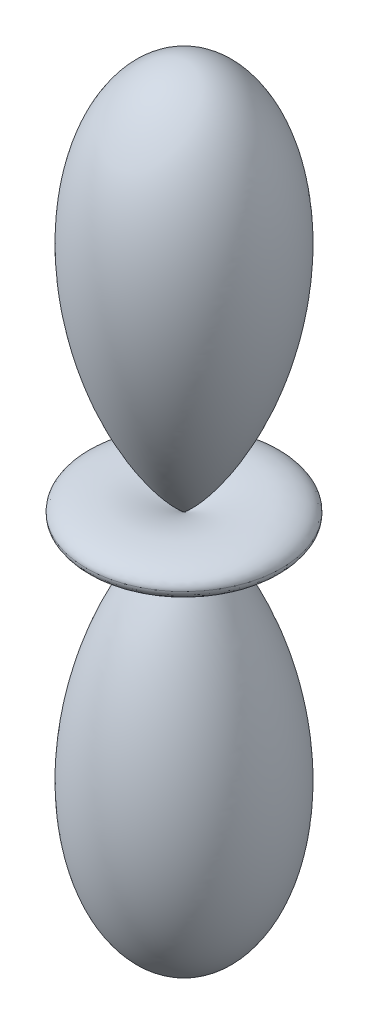
ISO-10303-21;
HEADER;
FILE_DESCRIPTION(('STEP AP214'),'2;1');
FILE_NAME('part.step','',(''),(''),'','','');
FILE_SCHEMA(('AUTOMOTIVE_DESIGN { 1 0 10303 214 1 1 1 1 }'));
ENDSEC;
DATA;
#1=APPLICATION_CONTEXT('core data for automotive mechanical design processes');
#2=APPLICATION_PROTOCOL_DEFINITION('international standard','automotive_design',2000,#1);
#3=PRODUCT_CONTEXT('',#1,'mechanical');
#4=PRODUCT('Part','Part','',(#3));
#5=PRODUCT_RELATED_PRODUCT_CATEGORY('part','',(#4));
#6=PRODUCT_DEFINITION_FORMATION('','',#4);
#7=PRODUCT_DEFINITION_CONTEXT('part definition',#1,'design');
#8=PRODUCT_DEFINITION('design','',#6,#7);
#9=PRODUCT_DEFINITION_SHAPE('','',#8);
#10=(LENGTH_UNIT() NAMED_UNIT(*) SI_UNIT(.MILLI.,.METRE.));
#11=(NAMED_UNIT(*) PLANE_ANGLE_UNIT() SI_UNIT($,.RADIAN.));
#12=(NAMED_UNIT(*) SI_UNIT($,.STERADIAN.) SOLID_ANGLE_UNIT());
#13=UNCERTAINTY_MEASURE_WITH_UNIT(LENGTH_MEASURE(1.E-05),#10,'distance_accuracy_value','');
#14=(GEOMETRIC_REPRESENTATION_CONTEXT(3) GLOBAL_UNCERTAINTY_ASSIGNED_CONTEXT((#13)) GLOBAL_UNIT_ASSIGNED_CONTEXT((#10,
#11,#12)) REPRESENTATION_CONTEXT('',''));
#15=CARTESIAN_POINT('',(0.,0.,0.));
#16=DIRECTION('',(0.,0.,1.));
#17=DIRECTION('',(1.,0.,0.));
#18=AXIS2_PLACEMENT_3D('',#15,#16,#17);
#19=CARTESIAN_POINT('',(-3.18160596551925E-10,-397.887357729739,0.));
#20=CARTESIAN_POINT('',(0.0876504563904565,-397.887357729739,0.));
#21=CARTESIAN_POINT('',(0.455246439323767,-397.886468376197,0.));
#22=CARTESIAN_POINT('',(1.23162692503277,-397.878338216358,0.));
#23=CARTESIAN_POINT('',(2.17816795492282,-397.85014010203,0.));
#24=CARTESIAN_POINT('',(3.42580082338765,-397.790228454526,0.));
#25=CARTESIAN_POINT('',(4.61694574441913,-397.704522118945,0.));
#26=CARTESIAN_POINT('',(5.8372099096875,-397.593127933542,0.));
#27=CARTESIAN_POINT('',(7.03680046975008,-397.456186465257,0.));
#28=CARTESIAN_POINT('',(8.24326881354219,-397.293864905155,0.));
#29=CARTESIAN_POINT('',(9.74070403642557,-397.059490697206,0.));
#30=CARTESIAN_POINT('',(11.5323435921975,-396.728331741206,0.));
#31=CARTESIAN_POINT('',(14.1993788228932,-396.139454654907,0.));
#32=CARTESIAN_POINT('',(17.1251078448229,-395.325351156734,0.));
#33=CARTESIAN_POINT('',(20.00306167225,-394.358372910581,0.));
#34=CARTESIAN_POINT('',(22.8275552870454,-393.246661374221,0.));
#35=CARTESIAN_POINT('',(25.0522772715719,-392.273842316122,0.));
#36=CARTESIAN_POINT('',(27.2404080284615,-391.221084751251,0.));
#37=CARTESIAN_POINT('',(29.3900091673878,-390.091943787361,0.));
#38=CARTESIAN_POINT('',(31.4997849788266,-388.889992927602,0.));
#39=CARTESIAN_POINT('',(33.5685065388073,-387.618775275836,0.));
#40=CARTESIAN_POINT('',(35.806800371351,-386.14228218634,0.));
#41=CARTESIAN_POINT('',(38.1979295205893,-384.440415498137,0.));
#42=CARTESIAN_POINT('',(41.4045621989811,-381.968292232635,0.));
#43=CARTESIAN_POINT('',(45.3949781887864,-378.533936735467,0.));
#44=CARTESIAN_POINT('',(49.8451997328688,-374.177288751914,0.));
#45=CARTESIAN_POINT('',(54.6128617558829,-368.797656252933,0.));
#46=CARTESIAN_POINT('',(59.0791765708193,-363.039031310991,0.));
#47=CARTESIAN_POINT('',(63.2465695725189,-356.94800101845,0.));
#48=CARTESIAN_POINT('',(67.1177629586468,-350.555675947556,0.));
#49=CARTESIAN_POINT('',(70.6527151593706,-343.971914028209,0.));
#50=CARTESIAN_POINT('',(73.8696440192901,-337.227704026216,0.));
#51=CARTESIAN_POINT('',(76.7536827100675,-330.436353023047,0.));
#52=CARTESIAN_POINT('',(79.3312978323709,-323.622876862487,0.));
#53=CARTESIAN_POINT('',(81.6520570285523,-316.717900074025,0.));
#54=CARTESIAN_POINT('',(83.7279596472421,-309.735584110901,0.));
#55=CARTESIAN_POINT('',(85.5699578131044,-302.68808515525,0.));
#56=CARTESIAN_POINT('',(87.1880795300196,-295.585972247842,0.));
#57=CARTESIAN_POINT('',(88.942263810361,-286.65152246637,0.));
#58=CARTESIAN_POINT('',(90.634475607638,-275.855522596578,0.));
#59=CARTESIAN_POINT('',(92.0398463543524,-263.182278757286,0.));
#60=CARTESIAN_POINT('',(92.916574192383,-248.637066331278,0.));
#61=CARTESIAN_POINT('',(93.1535113171598,-230.424773429299,0.));
#62=CARTESIAN_POINT('',(92.1347610441264,-208.583371905416,0.));
#63=CARTESIAN_POINT('',(89.1749268947525,-183.237650127363,0.));
#64=CARTESIAN_POINT('',(83.5256085425216,-154.629371503166,0.));
#65=CARTESIAN_POINT('',(75.7142629698706,-126.535499634635,0.));
#66=CARTESIAN_POINT('',(65.7943584916801,-99.1143486196402,0.));
#67=CARTESIAN_POINT('',(55.2691219539122,-75.8686972192706,0.));
#68=CARTESIAN_POINT('',(44.8868051032124,-56.6252039829437,0.));
#69=CARTESIAN_POINT('',(36.2317154672219,-42.7031826375667,0.));
#70=CARTESIAN_POINT('',(30.0759734769353,-33.6745616475581,0.));
#71=CARTESIAN_POINT('',(24.6703567724537,-26.3478237188819,0.));
#72=CARTESIAN_POINT('',(20.7321581462809,-21.336474857701,0.));
#73=CARTESIAN_POINT('',(17.237624132657,-17.1374379781833,0.));
#74=CARTESIAN_POINT('',(14.2224594020669,-13.6930057563079,0.));
#75=CARTESIAN_POINT('',(11.7336664479238,-10.9647244342948,0.));
#76=CARTESIAN_POINT('',(9.48856143117925,-8.6140836467625,0.));
#77=CARTESIAN_POINT('',(7.50503651166222,-6.6264277595999,0.));
#78=CARTESIAN_POINT('',(5.81919546230837,-5.00368188602272,0.));
#79=CARTESIAN_POINT('',(4.44884280338863,-3.72835762372999,0.));
#80=CARTESIAN_POINT('',(3.12338180727249,-2.54192336814065,0.));
#81=CARTESIAN_POINT('',(1.98538799992224,-1.56719715100692,0.));
#82=CARTESIAN_POINT('',(1.11538786524937,-0.855424104387772,0.));
#83=CARTESIAN_POINT('',(0.525671322615955,-0.392426362562673,0.));
#84=CARTESIAN_POINT('',(0.226996678456167,-0.165878191205637,0.));
#85=CARTESIAN_POINT('',(0.0759431183166673,-0.0549189067636391,0.));
#86=CARTESIAN_POINT('',(0.,0.,0.));
#87=B_SPLINE_CURVE_WITH_KNOTS('',4,(#19,#20,#21,#22,#23,#24,#25,#26,#27,#28,#29,#30,#31,#32,#33,
#34,#35,#36,#37,#38,#39,#40,#41,#42,#43,#44,#45,#46,#47,#48,#49,#50,#51,#52,#53,#54,#55,#56,#57,
#58,#59,#60,#61,#62,#63,#64,#65,#66,#67,#68,#69,#70,#71,#72,#73,#74,#75,#76,#77,#78,#79,#80,#81,
#82,#83,#84,#85,#86),.UNSPECIFIED.,.F.,.F.,(5,1,1,1,1,1,1,1,1,1,1,1,1,1,1,1,1,1,1,1,1,1,1,1,1,1,
1,1,1,1,1,1,1,1,1,1,1,1,1,1,1,1,1,1,1,1,1,1,1,1,1,1,1,1,1,1,1,1,1,1,1,1,1,1,5),(0.,
0.000754004804656705,0.00315938997927523,0.00556477515389364,0.00797016032851217,
0.0103755455031307,0.0127809306777492,0.0151863158523677,0.0175917010269863,0.0199970862016048,
0.0248078501139453,0.0296186140262856,0.0392401418509665,0.0440509213389743,0.048861700826982,
0.0536724803149898,0.0584832598029976,0.0632940770893701,0.0681048943757425,0.0729157116621151,
0.0777265289484875,0.0845451585888202,0.0913637882291529,0.105001047509818,0.119433355983627,
0.133865664457436,0.148297964287333,0.16273026411723,0.177902333107707,0.193074402098184,
0.207506746820802,0.22193909154342,0.236371436266038,0.250803780988657,0.265236179496005,
0.279668578003354,0.294100976510703,0.308533375018051,0.337398102681039,0.366262830344026,
0.395127612891473,0.423992395438919,0.481721926972363,0.539451476743425,0.597181026294302,
0.654910573922178,0.712640073793555,0.77036960007663,0.799234329837761,0.828099059598893,
0.842531441759112,0.856963823919332,0.871396206079551,0.878612397159661,0.885828588239771,
0.893247469982135,0.900666351724498,0.904375792595681,0.908085233466863,0.911794674338045,
0.915504115209226,0.9184754871816,0.919961173167786,0.92070401616088,0.921446859153973),.UNSPECIFIED.);
#88=CARTESIAN_POINT('',(0.,0.,0.));
#89=DIRECTION('',(0.,1.,0.));
#90=AXIS1_PLACEMENT('',#88,#89);
#91=SURFACE_OF_REVOLUTION('',#87,#90);
#92=CARTESIAN_POINT('',(0.,0.,0.));
#93=VERTEX_POINT('',#92);
#94=VERTEX_LOOP('',#93);
#95=FACE_BOUND('',#94,.T.);
#96=CARTESIAN_POINT('',(0.,-397.887357729739,0.));
#97=VERTEX_POINT('',#96);
#98=VERTEX_LOOP('',#97);
#99=FACE_BOUND('',#98,.T.);
#100=ADVANCED_FACE('P0_F16',(#95,#99),#91,.T.);
#101=CLOSED_SHELL('',(#100));
#102=MANIFOLD_SOLID_BREP('P0_B1',#101);
#103=CARTESIAN_POINT('',(99.4718394324346,-1.41039620800381E-10,0.));
#104=CARTESIAN_POINT('',(99.4718394324349,0.0144473478598722,0.));
#105=CARTESIAN_POINT('',(99.4715963263683,0.100376853939794,0.));
#106=CARTESIAN_POINT('',(99.4685044150183,0.260668693889387,0.));
#107=CARTESIAN_POINT('',(99.4533601096298,0.595682837165313,0.));
#108=CARTESIAN_POINT('',(99.41462537763,0.976418463843451,0.));
#109=CARTESIAN_POINT('',(99.3540461523916,1.36792825547944,0.));
#110=CARTESIAN_POINT('',(99.2534705677326,1.84681254939985,0.));
#111=CARTESIAN_POINT('',(99.1193903452542,2.34541049901015,0.));
#112=CARTESIAN_POINT('',(98.9206476731979,2.92374474966602,0.));
#113=CARTESIAN_POINT('',(98.6666319674632,3.50881884179896,0.));
#114=CARTESIAN_POINT('',(98.4016990429706,4.02461099086367,0.));
#115=CARTESIAN_POINT('',(98.0888839282801,4.56282402655693,0.));
#116=CARTESIAN_POINT('',(97.6951640008285,5.16212026891656,0.));
#117=CARTESIAN_POINT('',(97.1628176963727,5.86245289417468,0.));
#118=CARTESIAN_POINT('',(96.4373625251156,6.67731268259527,0.));
#119=CARTESIAN_POINT('',(95.5801255515856,7.50406015068173,0.));
#120=CARTESIAN_POINT('',(94.1898605246025,8.66771778819424,0.));
#121=CARTESIAN_POINT('',(92.1718544682701,10.0353728990684,0.));
#122=CARTESIAN_POINT('',(88.7774555219353,11.8371311972641,0.));
#123=CARTESIAN_POINT('',(83.7941691182405,13.6885492795961,0.));
#124=CARTESIAN_POINT('',(77.7625857397567,15.160935199828,0.));
#125=CARTESIAN_POINT('',(70.7294384458321,16.1308030471506,0.));
#126=CARTESIAN_POINT('',(63.5783466010685,16.5211973437359,0.));
#127=CARTESIAN_POINT('',(56.4188321795734,16.4110938369487,0.));
#128=CARTESIAN_POINT('',(49.2809304503626,15.8582302343043,0.));
#129=CARTESIAN_POINT('',(42.1864106461984,14.9008277002336,0.));
#130=CARTESIAN_POINT('',(35.1538909111103,13.5637629870977,0.));
#131=CARTESIAN_POINT('',(28.2009080374972,11.8610539754108,0.));
#132=CARTESIAN_POINT('',(21.346440136669,9.79684335553188,0.));
#133=CARTESIAN_POINT('',(15.4553760410452,7.66755148933256,0.));
#134=CARTESIAN_POINT('',(10.5026449447544,5.59592664226658,0.));
#135=CARTESIAN_POINT('',(6.62849030662822,3.7653929022448,0.));
#136=CARTESIAN_POINT('',(4.09896762801983,2.45476644253162,0.));
#137=CARTESIAN_POINT('',(2.24288406164808,1.40809591677828,0.));
#138=CARTESIAN_POINT('',(1.03451712583629,0.676317583030087,0.));
#139=CARTESIAN_POINT('',(0.438854819676063,0.296647328042432,0.));
#140=CARTESIAN_POINT('',(0.145358986213732,0.100261936553596,0.));
#141=CARTESIAN_POINT('',(0.,0.,0.));
#142=B_SPLINE_CURVE_WITH_KNOTS('',4,(#103,#104,#105,#106,#107,#108,#109,#110,#111,#112,#113,
#114,#115,#116,#117,#118,#119,#120,#121,#122,#123,#124,#125,#126,#127,#128,#129,#130,#131,#132,
#133,#134,#135,#136,#137,#138,#139,#140,#141),.UNSPECIFIED.,.F.,.F.,(5,1,1,1,1,1,1,1,1,1,1,1,1,
1,1,1,1,1,1,1,1,1,1,1,1,1,1,1,1,1,1,1,1,1,1,5),(0.,0.000530210460833125,0.00315120347170672,
0.00577219648258021,0.0110141825043273,0.0139325419690106,0.0168509014336941,0.0226876203630608,
0.0288778054913386,0.0350679906196163,0.0389048242343006,0.042741657848985,0.0504153250783538,
0.0598661429218292,0.0693169607653048,0.0804571481485323,0.09159733553176,0.122549245223811,
0.15350103347294,0.213139912019091,0.275043636222489,0.336947586705361,0.398851491376333,
0.460755318045574,0.522659212220314,0.584563072117397,0.646466896094265,0.708370874833197,
0.770274852626706,0.83217861305455,0.863130557962588,0.894082502870626,0.918524370822753,
0.930745304798817,0.936855771786849,0.942966238774881),.UNSPECIFIED.);
#143=CARTESIAN_POINT('',(-0.00647699333017381,-1000.04959738152,0.));
#144=DIRECTION('',(0.,-1.,0.));
#145=AXIS1_PLACEMENT('',#143,#144);
#146=SURFACE_OF_REVOLUTION('',#142,#145);
#147=CARTESIAN_POINT('',(-0.00647699333017381,0.,0.));
#148=DIRECTION('',(0.,-1.,0.));
#149=DIRECTION('',(0.,0.,-1.));
#150=AXIS2_PLACEMENT_3D('',#147,#148,#149);
#151=CIRCLE('',#150,0.00647699333017381);
#152=CARTESIAN_POINT('',(-0.00647699333017381,0.,-0.00647699333017381));
#153=VERTEX_POINT('',#152);
#154=EDGE_CURVE('P1_E9',#153,#153,#151,.T.);
#155=ORIENTED_EDGE('',*,*,#154,.T.);
#156=EDGE_LOOP('',(#155));
#157=FACE_BOUND('',#156,.T.);
#158=CARTESIAN_POINT('',(-0.00647699333017381,-1.99840144432528E-12,0.));
#159=DIRECTION('',(0.,-1.,0.));
#160=DIRECTION('',(0.,0.,-1.));
#161=AXIS2_PLACEMENT_3D('',#158,#159,#160);
#162=CIRCLE('',#161,99.4783164257647);
#163=CARTESIAN_POINT('',(-0.00647699333017381,-1.99840144432528E-12,-99.4783164257647));
#164=VERTEX_POINT('',#163);
#165=EDGE_CURVE('P1_E21',#164,#164,#162,.T.);
#166=ORIENTED_EDGE('',*,*,#165,.F.);
#167=EDGE_LOOP('',(#166));
#168=FACE_BOUND('',#167,.T.);
#169=ADVANCED_FACE('P1_F14',(#157,#168),#146,.F.);
#170=CARTESIAN_POINT('',(0.,0.,0.));
#171=CARTESIAN_POINT('',(0.145790193622739,-0.100692877462947,0.));
#172=CARTESIAN_POINT('',(0.440407379928867,-0.297572779508345,0.));
#173=CARTESIAN_POINT('',(1.03805586437076,-0.678588563776049,0.));
#174=CARTESIAN_POINT('',(2.25066357804879,-1.41265533661017,0.));
#175=CARTESIAN_POINT('',(4.11259306865996,-2.46221760241834,0.));
#176=CARTESIAN_POINT('',(6.64973718207151,-3.77601640337769,0.));
#177=CARTESIAN_POINT('',(10.5349426129518,-5.61039561330158,0.));
#178=CARTESIAN_POINT('',(15.5012055007063,-7.68558056846305,0.));
#179=CARTESIAN_POINT('',(21.4084209799942,-9.81774728798721,0.));
#180=CARTESIAN_POINT('',(28.281738353775,-11.8834826549286,0.));
#181=CARTESIAN_POINT('',(35.2538280249267,-13.585869012048,0.));
#182=CARTESIAN_POINT('',(42.3056239703544,-14.920600217194,0.));
#183=CARTESIAN_POINT('',(49.4194217917738,-15.8733792349676,0.));
#184=CARTESIAN_POINT('',(56.5764762379778,-16.418944424255,0.));
#185=CARTESIAN_POINT('',(63.7546399679416,-16.5184104428506,0.));
#186=CARTESIAN_POINT('',(70.9235749423757,-16.1131035353008,0.));
#187=CARTESIAN_POINT('',(77.9370723723476,-15.1273829323976,0.));
#188=CARTESIAN_POINT('',(83.9454366027072,-13.6418615029591,0.));
#189=CARTESIAN_POINT('',(88.4804835597658,-11.9390769856124,0.));
#190=CARTESIAN_POINT('',(91.5857939123231,-10.3444370524486,0.));
#191=CARTESIAN_POINT('',(93.3773120308152,-9.21910907250545,0.));
#192=CARTESIAN_POINT('',(94.6211634499267,-8.31228349452792,0.));
#193=CARTESIAN_POINT('',(95.658146182042,-7.43334181135984,0.));
#194=CARTESIAN_POINT('',(96.5023724026683,-6.60916461083643,0.));
#195=CARTESIAN_POINT('',(97.2160582091683,-5.79701297751152,0.));
#196=CARTESIAN_POINT('',(97.8058956345197,-5.0110922904425,0.));
#197=CARTESIAN_POINT('',(98.281855630458,-4.25547197867446,0.));
#198=CARTESIAN_POINT('',(98.6547440507108,-3.54355480916215,0.));
#199=CARTESIAN_POINT('',(98.9478686536208,-2.8532090963375,0.));
#200=CARTESIAN_POINT('',(99.1685637859559,-2.19180981457102,0.));
#201=CARTESIAN_POINT('',(99.3092091347701,-1.6172287444906,0.));
#202=CARTESIAN_POINT('',(99.3857432668323,-1.17271722607694,0.));
#203=CARTESIAN_POINT('',(99.424795149428,-0.858561984038454,0.));
#204=CARTESIAN_POINT('',(99.4465784140517,-0.635651827631848,0.));
#205=CARTESIAN_POINT('',(99.462596123465,-0.408875718974352,0.));
#206=CARTESIAN_POINT('',(99.4698934755191,-0.211493591159207,0.));
#207=CARTESIAN_POINT('',(99.4718394324338,-0.0704622141827346,0.));
#208=CARTESIAN_POINT('',(99.4718394324346,-2.02615944890745E-12,0.));
#209=B_SPLINE_CURVE_WITH_KNOTS('',4,(#170,#171,#172,#173,#174,#175,#176,#177,#178,#179,#180,
#181,#182,#183,#184,#185,#186,#187,#188,#189,#190,#191,#192,#193,#194,#195,#196,#197,#198,#199,
#200,#201,#202,#203,#204,#205,#206,#207,#208),.UNSPECIFIED.,.F.,.F.,(5,1,1,1,1,1,1,1,1,1,1,1,1,
1,1,1,1,1,1,1,1,1,1,1,1,1,1,1,1,1,1,1,1,1,1,5),(0.0570337613374331,0.0631650237517542,
0.0692962861660752,0.0815588109947173,0.106083860652002,0.13711564024273,0.168147419833458,
0.230210865849094,0.292274534971075,0.354338207733876,0.416401853051635,0.478465509236148,
0.540529113895668,0.602592798876097,0.664656392874267,0.726720052311666,0.788783727269288,
0.847344036582441,0.878375788009596,0.893891818620489,0.909407849231382,0.920502522196195,
0.931597195161008,0.940898325253081,0.950199455345154,0.957882364425979,0.965565273506804,
0.971771338025639,0.977977402544474,0.983816845074475,0.989656287604475,0.992242215703356,
0.993535179752797,0.994828143802237,0.997414071901119,1.),.UNSPECIFIED.);
#210=CARTESIAN_POINT('',(-0.00647699333017381,-1000.04959738152,0.));
#211=DIRECTION('',(0.,-1.,0.));
#212=AXIS1_PLACEMENT('',#210,#211);
#213=SURFACE_OF_REVOLUTION('',#209,#212);
#214=ORIENTED_EDGE('',*,*,#165,.T.);
#215=EDGE_LOOP('',(#214));
#216=FACE_BOUND('',#215,.T.);
#217=ORIENTED_EDGE('',*,*,#154,.F.);
#218=EDGE_LOOP('',(#217));
#219=FACE_BOUND('',#218,.T.);
#220=ADVANCED_FACE('P1_F37',(#216,#219),#213,.F.);
#221=CLOSED_SHELL('',(#169,#220));
#222=MANIFOLD_SOLID_BREP('P1_B1',#221);
#223=CARTESIAN_POINT('',(-2.02926264296774E-10,0.,0.));
#224=CARTESIAN_POINT('',(0.0717853702311734,0.0518540831576657,0.));
#225=CARTESIAN_POINT('',(0.214574658402708,0.156617176103664,0.));
#226=CARTESIAN_POINT('',(0.496950104184648,0.370472015656567,0.));
#227=CARTESIAN_POINT('',(1.05480117848832,0.807143191290645,0.));
#228=CARTESIAN_POINT('',(1.80993147111071,1.42253628754725,0.));
#229=CARTESIAN_POINT('',(2.75517558960353,2.22478092115772,0.));
#230=CARTESIAN_POINT('',(3.8179713715169,3.16179624411655,0.));
#231=CARTESIAN_POINT('',(4.86569385934361,4.11560903109981,0.));
#232=CARTESIAN_POINT('',(6.15846404705854,5.32614344579271,0.));
#233=CARTESIAN_POINT('',(7.73540123757646,6.85358925528498,0.));
#234=CARTESIAN_POINT('',(9.58158547287812,8.7122951681977,0.));
#235=CARTESIAN_POINT('',(11.6812615677432,10.9162868547804,0.));
#236=CARTESIAN_POINT('',(13.7853327582307,13.2120301004228,0.));
#237=CARTESIAN_POINT('',(16.3642335694762,16.1277597760601,0.));
#238=CARTESIAN_POINT('',(19.3817550662069,19.6936952107332,0.));
#239=CARTESIAN_POINT('',(22.9872803470232,24.175892530292,0.));
#240=CARTESIAN_POINT('',(27.1151224994141,29.6215039572647,0.));
#241=CARTESIAN_POINT('',(31.264471127031,35.4266337046961,0.));
#242=CARTESIAN_POINT('',(35.421520285346,41.5942284832149,0.));
#243=CARTESIAN_POINT('',(40.4166553362054,49.4354410446972,0.));
#244=CARTESIAN_POINT('',(46.1001905212503,59.0372397139515,0.));
#245=CARTESIAN_POINT('',(52.2970359402469,70.4866573089005,0.));
#246=CARTESIAN_POINT('',(58.806049892909,83.8654816794686,0.));
#247=CARTESIAN_POINT('',(64.7556363946668,97.5019901994042,0.));
#248=CARTESIAN_POINT('',(70.1533065932443,111.365996188055,0.));
#249=CARTESIAN_POINT('',(76.2138237634696,128.947781241798,0.));
#250=CARTESIAN_POINT('',(82.3851329356026,150.401479659337,0.));
#251=CARTESIAN_POINT('',(87.9565612696462,175.85445307802,0.));
#252=CARTESIAN_POINT('',(91.4893188724422,201.671593696003,0.));
#253=CARTESIAN_POINT('',(92.9633174753603,223.95019677703,0.));
#254=CARTESIAN_POINT('',(93.0831763057516,242.548610516012,0.));
#255=CARTESIAN_POINT('',(92.4788453526525,257.415887104169,0.));
#256=CARTESIAN_POINT('',(91.1324436504385,272.235269983792,0.));
#257=CARTESIAN_POINT('',(89.2609362308563,285.121341877209,0.));
#258=CARTESIAN_POINT('',(87.1237346026261,296.074187207267,0.));
#259=CARTESIAN_POINT('',(84.9645651868758,305.117720973332,0.));
#260=CARTESIAN_POINT('',(83.0002977932717,312.291991964506,0.));
#261=CARTESIAN_POINT('',(80.7880905592931,319.393915411633,0.));
#262=CARTESIAN_POINT('',(78.3158651569219,326.40978055237,0.));
#263=CARTESIAN_POINT('',(75.4437924694911,333.642399047453,0.));
#264=CARTESIAN_POINT('',(72.1115926642654,341.053624009429,0.));
#265=CARTESIAN_POINT('',(68.4055952646716,348.286566977112,0.));
#266=CARTESIAN_POINT('',(64.3010869279958,355.301256014537,0.));
#267=CARTESIAN_POINT('',(59.9872350366763,361.780670335443,0.));
#268=CARTESIAN_POINT('',(56.0614775939341,366.975711237159,0.));
#269=CARTESIAN_POINT('',(52.4587106026038,371.237111046211,0.));
#270=CARTESIAN_POINT('',(49.3094590246938,374.624260196504,0.));
#271=CARTESIAN_POINT('',(46.7122282427618,377.218856875807,0.));
#272=CARTESIAN_POINT('',(44.0347894297085,379.695399266055,0.));
#273=CARTESIAN_POINT('',(41.2785338232118,382.047149864307,0.));
#274=CARTESIAN_POINT('',(38.1625972451684,384.486727713384,0.));
#275=CARTESIAN_POINT('',(34.6557692879765,386.961468043147,0.));
#276=CARTESIAN_POINT('',(31.2523742071326,389.076715526544,0.));
#277=CARTESIAN_POINT('',(27.9857313781815,390.856962272368,0.));
#278=CARTESIAN_POINT('',(25.1964673558402,392.208298173918,0.));
#279=CARTESIAN_POINT('',(22.9266102876851,393.206259600711,0.));
#280=CARTESIAN_POINT('',(20.6205165479357,394.117367992805,0.));
#281=CARTESIAN_POINT('',(18.2806101065425,394.937999998564,0.));
#282=CARTESIAN_POINT('',(15.9099174966696,395.664697670681,0.));
#283=CARTESIAN_POINT('',(13.8111999527839,396.215547727999,0.));
#284=CARTESIAN_POINT('',(11.9975059985246,396.625156484187,0.));
#285=CARTESIAN_POINT('',(10.4768620296561,396.923999318133,0.));
#286=CARTESIAN_POINT('',(9.25630032529253,397.137281541315,0.));
#287=CARTESIAN_POINT('',(8.02997363430822,397.3245058938,0.));
#288=CARTESIAN_POINT('',(6.80259090209571,397.485435788982,0.));
#289=CARTESIAN_POINT('',(5.56743954570694,397.61986545504,0.));
#290=CARTESIAN_POINT('',(4.33762084541527,397.727621056107,0.));
#291=CARTESIAN_POINT('',(3.24680366679615,397.798444416699,0.));
#292=CARTESIAN_POINT('',(2.33173009735351,397.842324596822,0.));
#293=CARTESIAN_POINT('',(1.53514869391872,397.867652102055,0.));
#294=CARTESIAN_POINT('',(0.960353225409776,397.881163829733,0.));
#295=CARTESIAN_POINT('',(0.428381043301095,397.886231566278,0.));
#296=CARTESIAN_POINT('',(0.142763625402348,397.88735772974,0.));
#297=CARTESIAN_POINT('',(-3.04535525334229E-10,397.887357729738,0.));
#298=B_SPLINE_CURVE_WITH_KNOTS('',4,(#223,#224,#225,#226,#227,#228,#229,#230,#231,#232,#233,
#234,#235,#236,#237,#238,#239,#240,#241,#242,#243,#244,#245,#246,#247,#248,#249,#250,#251,#252,
#253,#254,#255,#256,#257,#258,#259,#260,#261,#262,#263,#264,#265,#266,#267,#268,#269,#270,#271,
#272,#273,#274,#275,#276,#277,#278,#279,#280,#281,#282,#283,#284,#285,#286,#287,#288,#289,#290,
#291,#292,#293,#294,#295,#296,#297),.UNSPECIFIED.,.F.,.F.,(5,1,1,1,1,1,1,1,1,1,1,1,1,1,1,1,1,1,
1,1,1,1,1,1,1,1,1,1,1,1,1,1,1,1,1,1,1,1,1,1,1,1,1,1,1,1,1,1,1,1,1,1,1,1,1,1,1,1,1,1,1,1,1,1,1,1,
1,1,1,1,1,5),(0.0785531407388983,0.0792550485535816,0.079956956368265,0.0813607719976317,
0.0841684032563651,0.0869760345150985,0.0897836657738319,0.0925912970325653,0.0953989282912987,
0.101014190808766,0.107184924739465,0.113355658670164,0.119526392600863,0.125697126531563,
0.138038594392961,0.15038006225436,0.165117482510547,0.179854902766735,0.194592323022922,
0.209329743279109,0.238804534996939,0.268279326714769,0.297754183049797,0.327229039384825,
0.356703990155851,0.386178940926877,0.445128621571967,0.504078336541666,0.563028074141747,
0.592502931402398,0.621977788663049,0.651452642205887,0.680927495748725,0.710402349098714,
0.725139775773709,0.739877202448704,0.75461467518413,0.769352147919556,0.784089620654982,
0.798827093390408,0.816283082191479,0.83373907099255,0.848476619588147,0.863214168183744,
0.877951515453782,0.885320189088802,0.892688862723821,0.899866839540109,0.907044816356397,
0.914222793172685,0.921400769988972,0.931225627062439,0.941050484135907,0.945962955850604,
0.9508754275653,0.955787899279997,0.960700370994694,0.965612835638806,0.970525300282918,
0.975437764927029,0.977893997249085,0.980350229571141,0.982806450874748,0.985262672178356,
0.987718893481963,0.990175114785571,0.992631336089178,0.995087557392785,0.996315668044589,
0.997543778696393,0.998771889348196,1.),.UNSPECIFIED.);
#299=CARTESIAN_POINT('',(-2.03023718592587E-10,397.887357729738,0.));
#300=DIRECTION('',(0.,1.,0.));
#301=AXIS1_PLACEMENT('',#299,#300);
#302=SURFACE_OF_REVOLUTION('',#298,#301);
#303=CARTESIAN_POINT('',(-2.03023718592587E-10,397.887357729738,0.));
#304=VERTEX_POINT('',#303);
#305=VERTEX_LOOP('',#304);
#306=FACE_BOUND('',#305,.T.);
#307=CARTESIAN_POINT('',(-2.0297499144468E-10,0.,0.));
#308=VERTEX_POINT('',#307);
#309=VERTEX_LOOP('',#308);
#310=FACE_BOUND('',#309,.T.);
#311=ADVANCED_FACE('P2_F16',(#306,#310),#302,.T.);
#312=CLOSED_SHELL('',(#311));
#313=MANIFOLD_SOLID_BREP('P2_B1',#312);
#314=ADVANCED_BREP_SHAPE_REPRESENTATION('',(#18,#102,#222,#313),#14);
#315=SHAPE_DEFINITION_REPRESENTATION(#9,#314);
ENDSEC;
END-ISO-10303-21;
